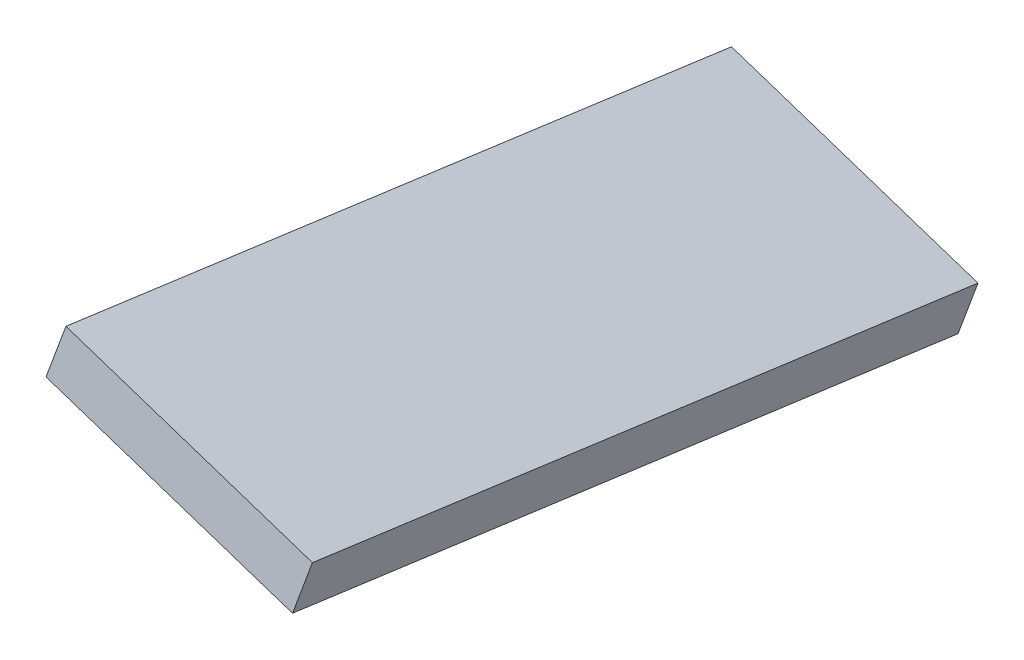
ISO-10303-21;
HEADER;
FILE_DESCRIPTION(('STEP AP214'),'2;1');
FILE_NAME('part.step','',(''),(''),'','','');
FILE_SCHEMA(('AUTOMOTIVE_DESIGN { 1 0 10303 214 1 1 1 1 }'));
ENDSEC;
DATA;
#1=APPLICATION_CONTEXT('core data for automotive mechanical design processes');
#2=APPLICATION_PROTOCOL_DEFINITION('international standard','automotive_design',2000,#1);
#3=PRODUCT_CONTEXT('',#1,'mechanical');
#4=PRODUCT('Part','Part','',(#3));
#5=PRODUCT_RELATED_PRODUCT_CATEGORY('part','',(#4));
#6=PRODUCT_DEFINITION_FORMATION('','',#4);
#7=PRODUCT_DEFINITION_CONTEXT('part definition',#1,'design');
#8=PRODUCT_DEFINITION('design','',#6,#7);
#9=PRODUCT_DEFINITION_SHAPE('','',#8);
#10=(LENGTH_UNIT() NAMED_UNIT(*) SI_UNIT(.MILLI.,.METRE.));
#11=(NAMED_UNIT(*) PLANE_ANGLE_UNIT() SI_UNIT($,.RADIAN.));
#12=(NAMED_UNIT(*) SI_UNIT($,.STERADIAN.) SOLID_ANGLE_UNIT());
#13=UNCERTAINTY_MEASURE_WITH_UNIT(LENGTH_MEASURE(1.E-05),#10,'distance_accuracy_value','');
#14=(GEOMETRIC_REPRESENTATION_CONTEXT(3) GLOBAL_UNCERTAINTY_ASSIGNED_CONTEXT((#13)) GLOBAL_UNIT_ASSIGNED_CONTEXT((#10,
#11,#12)) REPRESENTATION_CONTEXT('',''));
#15=CARTESIAN_POINT('',(0.,0.,0.));
#16=DIRECTION('',(0.,0.,1.));
#17=DIRECTION('',(1.,0.,0.));
#18=AXIS2_PLACEMENT_3D('',#15,#16,#17);
#19=CARTESIAN_POINT('',(8.55630936358898,16.289092757482,-133.4465766357));
#20=DIRECTION('',(0.962419369102324,-0.269081241765454,0.0366639237759148));
#21=DIRECTION('',(0.269262279634215,0.963066884887122,0.));
#22=AXIS2_PLACEMENT_3D('',#19,#20,#21);
#23=PLANE('',#22);
#24=DIRECTION('',(0.,-0.135008464262084,-0.990844445196921));
#25=VECTOR('',#24,1.);
#26=CARTESIAN_POINT('',(13.9876612386449,35.3612504739813,-136.045271855672));
#27=LINE('',#26,#25);
#28=CARTESIAN_POINT('',(13.9876612386449,71.9089765638182,132.183180179714));
#29=VERTEX_POINT('',#28);
#30=CARTESIAN_POINT('',(13.9876612386449,35.3612504739813,-136.045271855672));
#31=VERTEX_POINT('',#30);
#32=EDGE_CURVE('E80',#29,#31,#27,.T.);
#33=ORIENTED_EDGE('',*,*,#32,.F.);
#34=DIRECTION('',(0.271567593752798,0.953607885824963,-0.129934760998588));
#35=VECTOR('',#34,1.);
#36=CARTESIAN_POINT('',(8.55630936358898,52.8368188473189,134.781875399686));
#37=LINE('',#36,#35);
#38=CARTESIAN_POINT('',(8.55630936358898,52.8368188473189,134.781875399686));
#39=VERTEX_POINT('',#38);
#40=EDGE_CURVE('E10',#39,#29,#37,.T.);
#41=ORIENTED_EDGE('',*,*,#40,.F.);
#42=DIRECTION('',(0.,-0.135008464262084,-0.990844445196921));
#43=VECTOR('',#42,1.);
#44=CARTESIAN_POINT('',(8.55630936358898,16.289092757482,-133.4465766357));
#45=LINE('',#44,#43);
#46=CARTESIAN_POINT('',(8.55630936358898,16.289092757482,-133.4465766357));
#47=VERTEX_POINT('',#46);
#48=EDGE_CURVE('E74',#39,#47,#45,.T.);
#49=ORIENTED_EDGE('',*,*,#48,.T.);
#50=DIRECTION('',(0.271567593752798,0.953607885824963,-0.129934760998588));
#51=VECTOR('',#50,1.);
#52=CARTESIAN_POINT('',(8.55630936358898,16.289092757482,-133.4465766357));
#53=LINE('',#52,#51);
#54=EDGE_CURVE('E19',#47,#31,#53,.T.);
#55=ORIENTED_EDGE('',*,*,#54,.T.);
#56=EDGE_LOOP('',(#33,#41,#49,#55));
#57=FACE_BOUND('',#56,.T.);
#58=ADVANCED_FACE('F16',(#57),#23,.T.);
#59=CARTESIAN_POINT('',(-94.7285288198676,81.7140561579841,130.847179615355));
#60=DIRECTION('',(0.,0.135008464262084,0.990844445196921));
#61=DIRECTION('',(0.,-0.990844445196921,0.135008464262084));
#62=AXIS2_PLACEMENT_3D('',#59,#60,#61);
#63=PLANE('',#62);
#64=DIRECTION('',(0.962419369102324,-0.269081241765454,0.0366639237759146));
#65=VECTOR('',#64,1.);
#66=CARTESIAN_POINT('',(-89.2971769448117,100.786213874483,128.248484395383));
#67=LINE('',#66,#65);
#68=CARTESIAN_POINT('',(-89.2971769448117,100.786213874483,128.248484395383));
#69=VERTEX_POINT('',#68);
#70=EDGE_CURVE('E76',#69,#29,#67,.T.);
#71=ORIENTED_EDGE('',*,*,#70,.F.);
#72=DIRECTION('',(0.271567593752798,0.953607885824963,-0.129934760998588));
#73=VECTOR('',#72,1.);
#74=CARTESIAN_POINT('',(-94.7285288198676,81.7140561579841,130.847179615355));
#75=LINE('',#74,#73);
#76=CARTESIAN_POINT('',(-94.7285288198676,81.7140561579841,130.847179615355));
#77=VERTEX_POINT('',#76);
#78=EDGE_CURVE('E25',#77,#69,#75,.T.);
#79=ORIENTED_EDGE('',*,*,#78,.F.);
#80=DIRECTION('',(0.962419369102324,-0.269081241765454,0.0366639237759146));
#81=VECTOR('',#80,1.);
#82=CARTESIAN_POINT('',(-94.7285288198676,81.7140561579841,130.847179615355));
#83=LINE('',#82,#81);
#84=EDGE_CURVE('E71',#77,#39,#83,.T.);
#85=ORIENTED_EDGE('',*,*,#84,.T.);
#86=ORIENTED_EDGE('',*,*,#40,.T.);
#87=EDGE_LOOP('',(#71,#79,#85,#86));
#88=FACE_BOUND('',#87,.T.);
#89=ADVANCED_FACE('F90',(#88),#63,.T.);
#90=CARTESIAN_POINT('',(-94.7285288198676,45.1663300681472,-137.381272420031));
#91=DIRECTION('',(-0.962419369102324,0.269081241765454,-0.0366639237759148));
#92=DIRECTION('',(-0.269262279634215,-0.963066884887122,0.));
#93=AXIS2_PLACEMENT_3D('',#90,#91,#92);
#94=PLANE('',#93);
#95=DIRECTION('',(0.,0.135008464262084,0.990844445196921));
#96=VECTOR('',#95,1.);
#97=CARTESIAN_POINT('',(-89.2971769448117,64.2384877846465,-139.979967640003));
#98=LINE('',#97,#96);
#99=CARTESIAN_POINT('',(-89.2971769448117,64.2384877846465,-139.979967640003));
#100=VERTEX_POINT('',#99);
#101=EDGE_CURVE('E66',#100,#69,#98,.T.);
#102=ORIENTED_EDGE('',*,*,#101,.F.);
#103=DIRECTION('',(0.271567593752798,0.953607885824963,-0.129934760998588));
#104=VECTOR('',#103,1.);
#105=CARTESIAN_POINT('',(-94.7285288198676,45.1663300681472,-137.381272420031));
#106=LINE('',#105,#104);
#107=CARTESIAN_POINT('',(-94.7285288198676,45.1663300681472,-137.381272420031));
#108=VERTEX_POINT('',#107);
#109=EDGE_CURVE('E61',#108,#100,#106,.T.);
#110=ORIENTED_EDGE('',*,*,#109,.F.);
#111=DIRECTION('',(0.,0.135008464262084,0.990844445196921));
#112=VECTOR('',#111,1.);
#113=CARTESIAN_POINT('',(-94.7285288198676,45.1663300681472,-137.381272420031));
#114=LINE('',#113,#112);
#115=EDGE_CURVE('E64',#108,#77,#114,.T.);
#116=ORIENTED_EDGE('',*,*,#115,.T.);
#117=ORIENTED_EDGE('',*,*,#78,.T.);
#118=EDGE_LOOP('',(#102,#110,#116,#117));
#119=FACE_BOUND('',#118,.T.);
#120=ADVANCED_FACE('F63',(#119),#94,.T.);
#121=CARTESIAN_POINT('',(-94.7285288198676,45.1663300681472,-137.381272420031));
#122=DIRECTION('',(0.,-0.135008464262084,-0.990844445196921));
#123=DIRECTION('',(0.,0.990844445196921,-0.135008464262084));
#124=AXIS2_PLACEMENT_3D('',#121,#122,#123);
#125=PLANE('',#124);
#126=DIRECTION('',(-0.962419369102324,0.269081241765454,-0.0366639237759149));
#127=VECTOR('',#126,1.);
#128=CARTESIAN_POINT('',(-89.2971769448117,64.2384877846465,-139.979967640003));
#129=LINE('',#128,#127);
#130=EDGE_CURVE('E83',#31,#100,#129,.T.);
#131=ORIENTED_EDGE('',*,*,#130,.F.);
#132=ORIENTED_EDGE('',*,*,#54,.F.);
#133=DIRECTION('',(-0.962419369102324,0.269081241765454,-0.0366639237759149));
#134=VECTOR('',#133,1.);
#135=CARTESIAN_POINT('',(-94.7285288198676,45.1663300681472,-137.381272420031));
#136=LINE('',#135,#134);
#137=EDGE_CURVE('E70',#47,#108,#136,.T.);
#138=ORIENTED_EDGE('',*,*,#137,.T.);
#139=ORIENTED_EDGE('',*,*,#109,.T.);
#140=EDGE_LOOP('',(#131,#132,#138,#139));
#141=FACE_BOUND('',#140,.T.);
#142=ADVANCED_FACE('F73',(#141),#125,.T.);
#143=CARTESIAN_POINT('',(-1593.04165928557,461.359485969918,-214.406203682226));
#144=DIRECTION('',(0.271567593752798,0.953607885824963,-0.129934760998588));
#145=DIRECTION('',(-0.961761172575356,0.273889479400865,0.));
#146=AXIS2_PLACEMENT_3D('',#143,#144,#145);
#147=PLANE('',#146);
#148=ORIENTED_EDGE('',*,*,#48,.F.);
#149=ORIENTED_EDGE('',*,*,#84,.F.);
#150=ORIENTED_EDGE('',*,*,#115,.F.);
#151=ORIENTED_EDGE('',*,*,#137,.F.);
#152=EDGE_LOOP('',(#148,#149,#150,#151));
#153=FACE_BOUND('',#152,.T.);
#154=ADVANCED_FACE('F69',(#153),#147,.F.);
#155=CARTESIAN_POINT('',(-1587.61030741051,480.431643686417,-217.004898902198));
#156=DIRECTION('',(0.271567593752798,0.953607885824963,-0.129934760998588));
#157=DIRECTION('',(-0.961761172575356,0.273889479400865,0.));
#158=AXIS2_PLACEMENT_3D('',#155,#156,#157);
#159=PLANE('',#158);
#160=ORIENTED_EDGE('',*,*,#32,.T.);
#161=ORIENTED_EDGE('',*,*,#130,.T.);
#162=ORIENTED_EDGE('',*,*,#101,.T.);
#163=ORIENTED_EDGE('',*,*,#70,.T.);
#164=EDGE_LOOP('',(#160,#161,#162,#163));
#165=FACE_BOUND('',#164,.T.);
#166=ADVANCED_FACE('F89',(#165),#159,.T.);
#167=CLOSED_SHELL('',(#58,#89,#120,#142,#154,#166));
#168=MANIFOLD_SOLID_BREP('B1',#167);
#169=ADVANCED_BREP_SHAPE_REPRESENTATION('',(#18,#168),#14);
#170=SHAPE_DEFINITION_REPRESENTATION(#9,#169);
ENDSEC;
END-ISO-10303-21;
